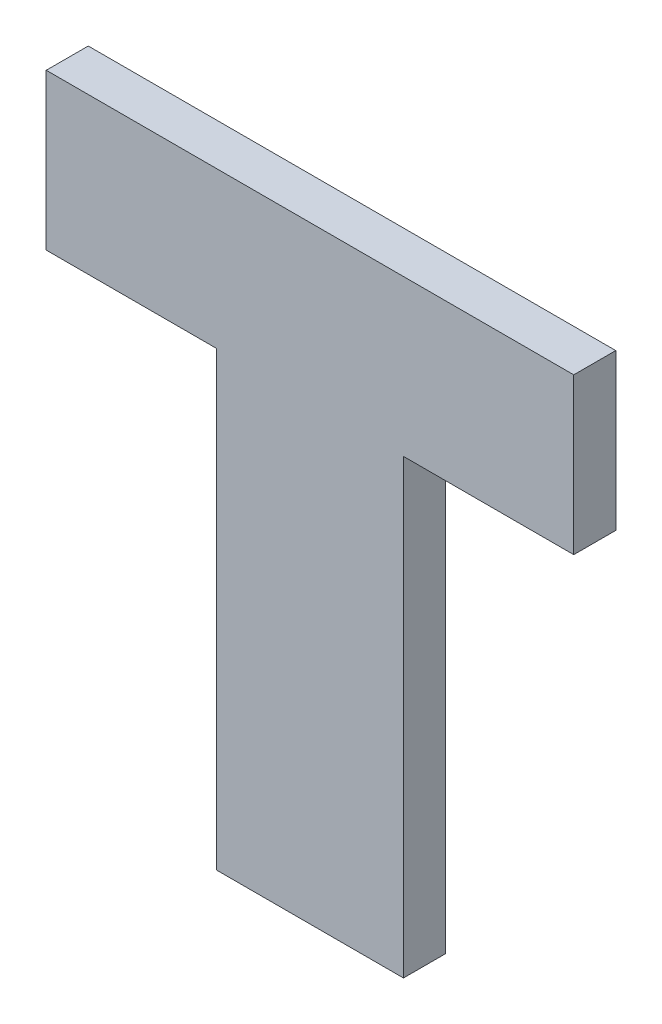
ISO-10303-21;
HEADER;
FILE_DESCRIPTION(('STEP AP214'),'2;1');
FILE_NAME('part.step','',(''),(''),'','','');
FILE_SCHEMA(('AUTOMOTIVE_DESIGN { 1 0 10303 214 1 1 1 1 }'));
ENDSEC;
DATA;
#1=APPLICATION_CONTEXT('core data for automotive mechanical design processes');
#2=APPLICATION_PROTOCOL_DEFINITION('international standard','automotive_design',2000,#1);
#3=PRODUCT_CONTEXT('',#1,'mechanical');
#4=PRODUCT('Part','Part','',(#3));
#5=PRODUCT_RELATED_PRODUCT_CATEGORY('part','',(#4));
#6=PRODUCT_DEFINITION_FORMATION('','',#4);
#7=PRODUCT_DEFINITION_CONTEXT('part definition',#1,'design');
#8=PRODUCT_DEFINITION('design','',#6,#7);
#9=PRODUCT_DEFINITION_SHAPE('','',#8);
#10=(LENGTH_UNIT() NAMED_UNIT(*) SI_UNIT(.MILLI.,.METRE.));
#11=(NAMED_UNIT(*) PLANE_ANGLE_UNIT() SI_UNIT($,.RADIAN.));
#12=(NAMED_UNIT(*) SI_UNIT($,.STERADIAN.) SOLID_ANGLE_UNIT());
#13=UNCERTAINTY_MEASURE_WITH_UNIT(LENGTH_MEASURE(1.E-05),#10,'distance_accuracy_value','');
#14=(GEOMETRIC_REPRESENTATION_CONTEXT(3) GLOBAL_UNCERTAINTY_ASSIGNED_CONTEXT((#13)) GLOBAL_UNIT_ASSIGNED_CONTEXT((#10,
#11,#12)) REPRESENTATION_CONTEXT('',''));
#15=CARTESIAN_POINT('',(0.,0.,0.));
#16=DIRECTION('',(0.,0.,1.));
#17=DIRECTION('',(1.,0.,0.));
#18=AXIS2_PLACEMENT_3D('',#15,#16,#17);
#19=CARTESIAN_POINT('',(0.,0.,0.05));
#20=DIRECTION('',(0.,0.,1.));
#21=DIRECTION('',(1.,0.,0.));
#22=AXIS2_PLACEMENT_3D('',#19,#20,#21);
#23=PLANE('',#22);
#24=DIRECTION('',(0.,1.,0.));
#25=VECTOR('',#24,1.);
#26=CARTESIAN_POINT('',(6.875526,0.654558,0.05));
#27=LINE('',#26,#25);
#28=CARTESIAN_POINT('',(6.875526,1.192276,0.05));
#29=VERTEX_POINT('',#28);
#30=CARTESIAN_POINT('',(6.875526,0.654558,0.05));
#31=VERTEX_POINT('',#30);
#32=EDGE_CURVE('E94',#29,#31,#27,.F.);
#33=ORIENTED_EDGE('',*,*,#32,.F.);
#34=DIRECTION('',(1.,0.,0.));
#35=VECTOR('',#34,1.);
#36=CARTESIAN_POINT('',(6.875526,1.192276,0.05));
#37=LINE('',#36,#35);
#38=CARTESIAN_POINT('',(7.078218,1.192276,0.05));
#39=VERTEX_POINT('',#38);
#40=EDGE_CURVE('E20',#39,#29,#37,.F.);
#41=ORIENTED_EDGE('',*,*,#40,.F.);
#42=DIRECTION('',(0.,1.,0.));
#43=VECTOR('',#42,1.);
#44=CARTESIAN_POINT('',(7.078218,1.192276,0.05));
#45=LINE('',#44,#43);
#46=CARTESIAN_POINT('',(7.078218,1.377696,0.05));
#47=VERTEX_POINT('',#46);
#48=EDGE_CURVE('E83',#47,#39,#45,.F.);
#49=ORIENTED_EDGE('',*,*,#48,.F.);
#50=DIRECTION('',(1.,0.,0.));
#51=VECTOR('',#50,1.);
#52=CARTESIAN_POINT('',(7.078218,1.377696,0.05));
#53=LINE('',#52,#51);
#54=CARTESIAN_POINT('',(6.45033,1.377696,0.05));
#55=VERTEX_POINT('',#54);
#56=EDGE_CURVE('E78',#55,#47,#53,.T.);
#57=ORIENTED_EDGE('',*,*,#56,.F.);
#58=DIRECTION('',(0.,1.,0.));
#59=VECTOR('',#58,1.);
#60=CARTESIAN_POINT('',(6.45033,1.377696,0.05));
#61=LINE('',#60,#59);
#62=CARTESIAN_POINT('',(6.45033,1.192276,0.05));
#63=VERTEX_POINT('',#62);
#64=EDGE_CURVE('E105',#63,#55,#61,.T.);
#65=ORIENTED_EDGE('',*,*,#64,.F.);
#66=DIRECTION('',(1.,0.,0.));
#67=VECTOR('',#66,1.);
#68=CARTESIAN_POINT('',(6.45033,1.192276,0.05));
#69=LINE('',#68,#67);
#70=CARTESIAN_POINT('',(6.652768,1.192276,0.05));
#71=VERTEX_POINT('',#70);
#72=EDGE_CURVE('E109',#71,#63,#69,.F.);
#73=ORIENTED_EDGE('',*,*,#72,.F.);
#74=DIRECTION('',(0.,1.,0.));
#75=VECTOR('',#74,1.);
#76=CARTESIAN_POINT('',(6.652768,1.192276,0.05));
#77=LINE('',#76,#75);
#78=CARTESIAN_POINT('',(6.652768,0.654558,0.05));
#79=VERTEX_POINT('',#78);
#80=EDGE_CURVE('E113',#79,#71,#77,.T.);
#81=ORIENTED_EDGE('',*,*,#80,.F.);
#82=DIRECTION('',(1.,0.,0.));
#83=VECTOR('',#82,1.);
#84=CARTESIAN_POINT('',(6.652768,0.654558,0.05));
#85=LINE('',#84,#83);
#86=EDGE_CURVE('E117',#31,#79,#85,.F.);
#87=ORIENTED_EDGE('',*,*,#86,.F.);
#88=EDGE_LOOP('',(#33,#41,#49,#57,#65,#73,#81,#87));
#89=FACE_BOUND('',#88,.T.);
#90=ADVANCED_FACE('F17',(#89),#23,.T.);
#91=CARTESIAN_POINT('',(6.875526,1.192276,0.));
#92=DIRECTION('',(0.,-1.,0.));
#93=DIRECTION('',(0.,0.,-1.));
#94=AXIS2_PLACEMENT_3D('',#91,#92,#93);
#95=PLANE('',#94);
#96=DIRECTION('',(0.,0.,-1.));
#97=VECTOR('',#96,1.);
#98=CARTESIAN_POINT('',(6.875526,1.192276,0.));
#99=LINE('',#98,#97);
#100=CARTESIAN_POINT('',(6.875526,1.192276,0.));
#101=VERTEX_POINT('',#100);
#102=EDGE_CURVE('E121',#101,#29,#99,.F.);
#103=ORIENTED_EDGE('',*,*,#102,.F.);
#104=DIRECTION('',(1.,0.,0.));
#105=VECTOR('',#104,1.);
#106=CARTESIAN_POINT('',(0.,1.192276,0.));
#107=LINE('',#106,#105);
#108=CARTESIAN_POINT('',(7.078218,1.192276,0.));
#109=VERTEX_POINT('',#108);
#110=EDGE_CURVE('E100',#101,#109,#107,.T.);
#111=ORIENTED_EDGE('',*,*,#110,.T.);
#112=DIRECTION('',(0.,0.,-1.));
#113=VECTOR('',#112,1.);
#114=CARTESIAN_POINT('',(7.078218,1.192276,0.));
#115=LINE('',#114,#113);
#116=EDGE_CURVE('E88',#39,#109,#115,.T.);
#117=ORIENTED_EDGE('',*,*,#116,.F.);
#118=ORIENTED_EDGE('',*,*,#40,.T.);
#119=EDGE_LOOP('',(#103,#111,#117,#118));
#120=FACE_BOUND('',#119,.T.);
#121=ADVANCED_FACE('F99',(#120),#95,.T.);
#122=CARTESIAN_POINT('',(7.078218,1.192276,0.));
#123=DIRECTION('',(1.,0.,0.));
#124=DIRECTION('',(0.,0.,-1.));
#125=AXIS2_PLACEMENT_3D('',#122,#123,#124);
#126=PLANE('',#125);
#127=ORIENTED_EDGE('',*,*,#116,.T.);
#128=DIRECTION('',(0.,1.,0.));
#129=VECTOR('',#128,1.);
#130=CARTESIAN_POINT('',(7.078218,0.,0.));
#131=LINE('',#130,#129);
#132=CARTESIAN_POINT('',(7.078218,1.377696,0.));
#133=VERTEX_POINT('',#132);
#134=EDGE_CURVE('E126',#109,#133,#131,.T.);
#135=ORIENTED_EDGE('',*,*,#134,.T.);
#136=DIRECTION('',(0.,0.,1.));
#137=VECTOR('',#136,1.);
#138=CARTESIAN_POINT('',(7.078218,1.377696,0.));
#139=LINE('',#138,#137);
#140=EDGE_CURVE('E90',#47,#133,#139,.F.);
#141=ORIENTED_EDGE('',*,*,#140,.F.);
#142=ORIENTED_EDGE('',*,*,#48,.T.);
#143=EDGE_LOOP('',(#127,#135,#141,#142));
#144=FACE_BOUND('',#143,.T.);
#145=ADVANCED_FACE('F85',(#144),#126,.T.);
#146=CARTESIAN_POINT('',(7.078218,1.377696,0.));
#147=DIRECTION('',(0.,1.,0.));
#148=DIRECTION('',(0.,0.,1.));
#149=AXIS2_PLACEMENT_3D('',#146,#147,#148);
#150=PLANE('',#149);
#151=ORIENTED_EDGE('',*,*,#140,.T.);
#152=DIRECTION('',(1.,0.,0.));
#153=VECTOR('',#152,1.);
#154=CARTESIAN_POINT('',(0.,1.377696,0.));
#155=LINE('',#154,#153);
#156=CARTESIAN_POINT('',(6.45033,1.377696,0.));
#157=VERTEX_POINT('',#156);
#158=EDGE_CURVE('E128',#133,#157,#155,.F.);
#159=ORIENTED_EDGE('',*,*,#158,.T.);
#160=DIRECTION('',(0.,0.,1.));
#161=VECTOR('',#160,1.);
#162=CARTESIAN_POINT('',(6.45033,1.377696,0.));
#163=LINE('',#162,#161);
#164=EDGE_CURVE('E107',#55,#157,#163,.F.);
#165=ORIENTED_EDGE('',*,*,#164,.F.);
#166=ORIENTED_EDGE('',*,*,#56,.T.);
#167=EDGE_LOOP('',(#151,#159,#165,#166));
#168=FACE_BOUND('',#167,.T.);
#169=ADVANCED_FACE('F162',(#168),#150,.T.);
#170=CARTESIAN_POINT('',(6.45033,1.377696,0.));
#171=DIRECTION('',(-1.,0.,0.));
#172=DIRECTION('',(0.,0.,1.));
#173=AXIS2_PLACEMENT_3D('',#170,#171,#172);
#174=PLANE('',#173);
#175=ORIENTED_EDGE('',*,*,#164,.T.);
#176=DIRECTION('',(0.,1.,0.));
#177=VECTOR('',#176,1.);
#178=CARTESIAN_POINT('',(6.45033,0.,0.));
#179=LINE('',#178,#177);
#180=CARTESIAN_POINT('',(6.45033,1.192276,0.));
#181=VERTEX_POINT('',#180);
#182=EDGE_CURVE('E131',#157,#181,#179,.F.);
#183=ORIENTED_EDGE('',*,*,#182,.T.);
#184=DIRECTION('',(0.,0.,-1.));
#185=VECTOR('',#184,1.);
#186=CARTESIAN_POINT('',(6.45033,1.192276,0.));
#187=LINE('',#186,#185);
#188=EDGE_CURVE('E111',#63,#181,#187,.T.);
#189=ORIENTED_EDGE('',*,*,#188,.F.);
#190=ORIENTED_EDGE('',*,*,#64,.T.);
#191=EDGE_LOOP('',(#175,#183,#189,#190));
#192=FACE_BOUND('',#191,.T.);
#193=ADVANCED_FACE('F161',(#192),#174,.T.);
#194=CARTESIAN_POINT('',(6.45033,1.192276,0.));
#195=DIRECTION('',(0.,-1.,0.));
#196=DIRECTION('',(0.,0.,-1.));
#197=AXIS2_PLACEMENT_3D('',#194,#195,#196);
#198=PLANE('',#197);
#199=ORIENTED_EDGE('',*,*,#188,.T.);
#200=DIRECTION('',(1.,0.,0.));
#201=VECTOR('',#200,1.);
#202=CARTESIAN_POINT('',(0.,1.192276,0.));
#203=LINE('',#202,#201);
#204=CARTESIAN_POINT('',(6.652768,1.192276,0.));
#205=VERTEX_POINT('',#204);
#206=EDGE_CURVE('E134',#181,#205,#203,.T.);
#207=ORIENTED_EDGE('',*,*,#206,.T.);
#208=DIRECTION('',(0.,0.,1.));
#209=VECTOR('',#208,1.);
#210=CARTESIAN_POINT('',(6.652768,1.192276,0.));
#211=LINE('',#210,#209);
#212=EDGE_CURVE('E115',#71,#205,#211,.F.);
#213=ORIENTED_EDGE('',*,*,#212,.F.);
#214=ORIENTED_EDGE('',*,*,#72,.T.);
#215=EDGE_LOOP('',(#199,#207,#213,#214));
#216=FACE_BOUND('',#215,.T.);
#217=ADVANCED_FACE('F155',(#216),#198,.T.);
#218=CARTESIAN_POINT('',(6.652768,1.192276,0.));
#219=DIRECTION('',(-1.,0.,0.));
#220=DIRECTION('',(0.,0.,1.));
#221=AXIS2_PLACEMENT_3D('',#218,#219,#220);
#222=PLANE('',#221);
#223=ORIENTED_EDGE('',*,*,#212,.T.);
#224=DIRECTION('',(0.,1.,0.));
#225=VECTOR('',#224,1.);
#226=CARTESIAN_POINT('',(6.652768,0.,0.));
#227=LINE('',#226,#225);
#228=CARTESIAN_POINT('',(6.652768,0.654558,0.));
#229=VERTEX_POINT('',#228);
#230=EDGE_CURVE('E137',#205,#229,#227,.F.);
#231=ORIENTED_EDGE('',*,*,#230,.T.);
#232=DIRECTION('',(0.,0.,-1.));
#233=VECTOR('',#232,1.);
#234=CARTESIAN_POINT('',(6.652768,0.654558,0.));
#235=LINE('',#234,#233);
#236=EDGE_CURVE('E119',#79,#229,#235,.T.);
#237=ORIENTED_EDGE('',*,*,#236,.F.);
#238=ORIENTED_EDGE('',*,*,#80,.T.);
#239=EDGE_LOOP('',(#223,#231,#237,#238));
#240=FACE_BOUND('',#239,.T.);
#241=ADVANCED_FACE('F150',(#240),#222,.T.);
#242=CARTESIAN_POINT('',(6.652768,0.654558,0.));
#243=DIRECTION('',(0.,-1.,0.));
#244=DIRECTION('',(0.,0.,-1.));
#245=AXIS2_PLACEMENT_3D('',#242,#243,#244);
#246=PLANE('',#245);
#247=ORIENTED_EDGE('',*,*,#236,.T.);
#248=DIRECTION('',(1.,0.,0.));
#249=VECTOR('',#248,1.);
#250=CARTESIAN_POINT('',(0.,0.654558,0.));
#251=LINE('',#250,#249);
#252=CARTESIAN_POINT('',(6.875526,0.654558,0.));
#253=VERTEX_POINT('',#252);
#254=EDGE_CURVE('E26',#229,#253,#251,.T.);
#255=ORIENTED_EDGE('',*,*,#254,.T.);
#256=DIRECTION('',(0.,0.,-1.));
#257=VECTOR('',#256,1.);
#258=CARTESIAN_POINT('',(6.875526,0.654558,0.));
#259=LINE('',#258,#257);
#260=EDGE_CURVE('E34',#31,#253,#259,.T.);
#261=ORIENTED_EDGE('',*,*,#260,.F.);
#262=ORIENTED_EDGE('',*,*,#86,.T.);
#263=EDGE_LOOP('',(#247,#255,#261,#262));
#264=FACE_BOUND('',#263,.T.);
#265=ADVANCED_FACE('F143',(#264),#246,.T.);
#266=CARTESIAN_POINT('',(6.875526,0.654558,0.));
#267=DIRECTION('',(1.,0.,0.));
#268=DIRECTION('',(0.,0.,-1.));
#269=AXIS2_PLACEMENT_3D('',#266,#267,#268);
#270=PLANE('',#269);
#271=ORIENTED_EDGE('',*,*,#260,.T.);
#272=DIRECTION('',(0.,1.,0.));
#273=VECTOR('',#272,1.);
#274=CARTESIAN_POINT('',(6.875526,0.,0.));
#275=LINE('',#274,#273);
#276=EDGE_CURVE('E11',#253,#101,#275,.T.);
#277=ORIENTED_EDGE('',*,*,#276,.T.);
#278=ORIENTED_EDGE('',*,*,#102,.T.);
#279=ORIENTED_EDGE('',*,*,#32,.T.);
#280=EDGE_LOOP('',(#271,#277,#278,#279));
#281=FACE_BOUND('',#280,.T.);
#282=ADVANCED_FACE('F163',(#281),#270,.T.);
#283=CARTESIAN_POINT('',(0.,0.,0.));
#284=DIRECTION('',(0.,0.,1.));
#285=DIRECTION('',(1.,0.,0.));
#286=AXIS2_PLACEMENT_3D('',#283,#284,#285);
#287=PLANE('',#286);
#288=ORIENTED_EDGE('',*,*,#254,.F.);
#289=ORIENTED_EDGE('',*,*,#230,.F.);
#290=ORIENTED_EDGE('',*,*,#206,.F.);
#291=ORIENTED_EDGE('',*,*,#182,.F.);
#292=ORIENTED_EDGE('',*,*,#158,.F.);
#293=ORIENTED_EDGE('',*,*,#134,.F.);
#294=ORIENTED_EDGE('',*,*,#110,.F.);
#295=ORIENTED_EDGE('',*,*,#276,.F.);
#296=EDGE_LOOP('',(#288,#289,#290,#291,#292,#293,#294,#295));
#297=FACE_BOUND('',#296,.T.);
#298=ADVANCED_FACE('F147',(#297),#287,.F.);
#299=CLOSED_SHELL('',(#90,#121,#145,#169,#193,#217,#241,#265,#282,#298));
#300=MANIFOLD_SOLID_BREP('B1',#299);
#301=ADVANCED_BREP_SHAPE_REPRESENTATION('',(#18,#300),#14);
#302=SHAPE_DEFINITION_REPRESENTATION(#9,#301);
ENDSEC;
END-ISO-10303-21;
